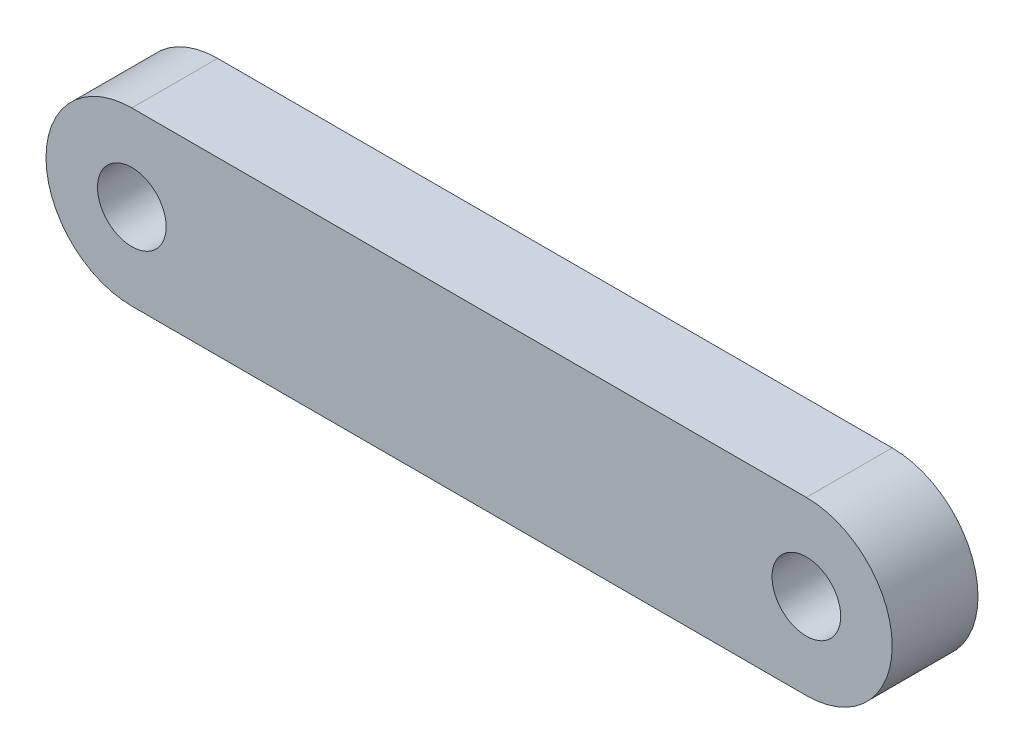
ISO-10303-21;
HEADER;
FILE_DESCRIPTION(('STEP AP214'),'2;1');
FILE_NAME('part.step','',(''),(''),'','','');
FILE_SCHEMA(('AUTOMOTIVE_DESIGN { 1 0 10303 214 1 1 1 1 }'));
ENDSEC;
DATA;
#1=APPLICATION_CONTEXT('core data for automotive mechanical design processes');
#2=APPLICATION_PROTOCOL_DEFINITION('international standard','automotive_design',2000,#1);
#3=PRODUCT_CONTEXT('',#1,'mechanical');
#4=PRODUCT('Part','Part','',(#3));
#5=PRODUCT_RELATED_PRODUCT_CATEGORY('part','',(#4));
#6=PRODUCT_DEFINITION_FORMATION('','',#4);
#7=PRODUCT_DEFINITION_CONTEXT('part definition',#1,'design');
#8=PRODUCT_DEFINITION('design','',#6,#7);
#9=PRODUCT_DEFINITION_SHAPE('','',#8);
#10=(LENGTH_UNIT() NAMED_UNIT(*) SI_UNIT(.MILLI.,.METRE.));
#11=(NAMED_UNIT(*) PLANE_ANGLE_UNIT() SI_UNIT($,.RADIAN.));
#12=(NAMED_UNIT(*) SI_UNIT($,.STERADIAN.) SOLID_ANGLE_UNIT());
#13=UNCERTAINTY_MEASURE_WITH_UNIT(LENGTH_MEASURE(1.E-05),#10,'distance_accuracy_value','');
#14=(GEOMETRIC_REPRESENTATION_CONTEXT(3) GLOBAL_UNCERTAINTY_ASSIGNED_CONTEXT((#13)) GLOBAL_UNIT_ASSIGNED_CONTEXT((#10,
#11,#12)) REPRESENTATION_CONTEXT('',''));
#15=CARTESIAN_POINT('',(0.,0.,0.));
#16=DIRECTION('',(0.,0.,1.));
#17=DIRECTION('',(1.,0.,0.));
#18=AXIS2_PLACEMENT_3D('',#15,#16,#17);
#19=CARTESIAN_POINT('',(-19.65,0.,2.5));
#20=DIRECTION('',(0.,0.,1.));
#21=DIRECTION('',(1.,0.,0.));
#22=AXIS2_PLACEMENT_3D('',#19,#20,#21);
#23=PLANE('',#22);
#24=CARTESIAN_POINT('',(19.65,0.,2.5));
#25=DIRECTION('',(0.,0.,1.));
#26=DIRECTION('',(1.,0.,0.));
#27=AXIS2_PLACEMENT_3D('',#24,#25,#26);
#28=CIRCLE('',#27,2.);
#29=CARTESIAN_POINT('',(21.65,0.,2.5));
#30=VERTEX_POINT('',#29);
#31=EDGE_CURVE('E112',#30,#30,#28,.T.);
#32=ORIENTED_EDGE('',*,*,#31,.F.);
#33=EDGE_LOOP('',(#32));
#34=FACE_BOUND('',#33,.T.);
#35=CARTESIAN_POINT('',(-19.65,0.,2.5));
#36=DIRECTION('',(0.,0.,1.));
#37=DIRECTION('',(1.,0.,0.));
#38=AXIS2_PLACEMENT_3D('',#35,#36,#37);
#39=CIRCLE('',#38,5.);
#40=CARTESIAN_POINT('',(-19.65,5.,2.5));
#41=VERTEX_POINT('',#40);
#42=CARTESIAN_POINT('',(-19.65,-5.,2.5));
#43=VERTEX_POINT('',#42);
#44=EDGE_CURVE('E92',#41,#43,#39,.T.);
#45=ORIENTED_EDGE('',*,*,#44,.T.);
#46=DIRECTION('',(1.,0.,0.));
#47=VECTOR('',#46,1.);
#48=CARTESIAN_POINT('',(-19.65,-5.,2.5));
#49=LINE('',#48,#47);
#50=CARTESIAN_POINT('',(19.65,-4.99999999999999,2.5));
#51=VERTEX_POINT('',#50);
#52=EDGE_CURVE('E87',#43,#51,#49,.T.);
#53=ORIENTED_EDGE('',*,*,#52,.T.);
#54=CARTESIAN_POINT('',(19.65,0.,2.5));
#55=DIRECTION('',(0.,0.,1.));
#56=DIRECTION('',(1.,0.,0.));
#57=AXIS2_PLACEMENT_3D('',#54,#55,#56);
#58=CIRCLE('',#57,5.);
#59=CARTESIAN_POINT('',(19.65,5.00000000000001,2.5));
#60=VERTEX_POINT('',#59);
#61=EDGE_CURVE('E90',#51,#60,#58,.T.);
#62=ORIENTED_EDGE('',*,*,#61,.T.);
#63=DIRECTION('',(-1.,0.,0.));
#64=VECTOR('',#63,1.);
#65=CARTESIAN_POINT('',(-19.65,5.,2.5));
#66=LINE('',#65,#64);
#67=EDGE_CURVE('E57',#60,#41,#66,.T.);
#68=ORIENTED_EDGE('',*,*,#67,.T.);
#69=EDGE_LOOP('',(#45,#53,#62,#68));
#70=FACE_BOUND('',#69,.T.);
#71=CARTESIAN_POINT('',(-19.65,0.,2.5));
#72=DIRECTION('',(0.,0.,1.));
#73=DIRECTION('',(1.,0.,0.));
#74=AXIS2_PLACEMENT_3D('',#71,#72,#73);
#75=CIRCLE('',#74,2.);
#76=CARTESIAN_POINT('',(-17.65,0.,2.5));
#77=VERTEX_POINT('',#76);
#78=EDGE_CURVE('E134',#77,#77,#75,.T.);
#79=ORIENTED_EDGE('',*,*,#78,.F.);
#80=EDGE_LOOP('',(#79));
#81=FACE_BOUND('',#80,.T.);
#82=ADVANCED_FACE('F39',(#34,#70,#81),#23,.T.);
#83=CARTESIAN_POINT('',(-19.65,0.,-2.5));
#84=DIRECTION('',(0.,0.,1.));
#85=DIRECTION('',(1.,0.,0.));
#86=AXIS2_PLACEMENT_3D('',#83,#84,#85);
#87=PLANE('',#86);
#88=CARTESIAN_POINT('',(-19.65,0.,-2.5));
#89=DIRECTION('',(0.,0.,1.));
#90=DIRECTION('',(1.,0.,0.));
#91=AXIS2_PLACEMENT_3D('',#88,#89,#90);
#92=CIRCLE('',#91,5.);
#93=CARTESIAN_POINT('',(-19.65,5.,-2.5));
#94=VERTEX_POINT('',#93);
#95=CARTESIAN_POINT('',(-19.65,-5.,-2.5));
#96=VERTEX_POINT('',#95);
#97=EDGE_CURVE('E108',#94,#96,#92,.T.);
#98=ORIENTED_EDGE('',*,*,#97,.F.);
#99=DIRECTION('',(-1.,0.,0.));
#100=VECTOR('',#99,1.);
#101=CARTESIAN_POINT('',(-19.65,5.,-2.5));
#102=LINE('',#101,#100);
#103=CARTESIAN_POINT('',(19.65,5.00000000000001,-2.5));
#104=VERTEX_POINT('',#103);
#105=EDGE_CURVE('E80',#104,#94,#102,.T.);
#106=ORIENTED_EDGE('',*,*,#105,.F.);
#107=CARTESIAN_POINT('',(19.65,0.,-2.5));
#108=DIRECTION('',(0.,0.,1.));
#109=DIRECTION('',(1.,0.,0.));
#110=AXIS2_PLACEMENT_3D('',#107,#108,#109);
#111=CIRCLE('',#110,5.);
#112=CARTESIAN_POINT('',(19.65,-4.99999999999999,-2.5));
#113=VERTEX_POINT('',#112);
#114=EDGE_CURVE('E74',#113,#104,#111,.T.);
#115=ORIENTED_EDGE('',*,*,#114,.F.);
#116=DIRECTION('',(1.,0.,0.));
#117=VECTOR('',#116,1.);
#118=CARTESIAN_POINT('',(-19.65,-5.,-2.5));
#119=LINE('',#118,#117);
#120=EDGE_CURVE('E97',#96,#113,#119,.T.);
#121=ORIENTED_EDGE('',*,*,#120,.F.);
#122=EDGE_LOOP('',(#98,#106,#115,#121));
#123=FACE_BOUND('',#122,.T.);
#124=CARTESIAN_POINT('',(19.65,0.,-2.5));
#125=DIRECTION('',(0.,0.,1.));
#126=DIRECTION('',(1.,0.,0.));
#127=AXIS2_PLACEMENT_3D('',#124,#125,#126);
#128=CIRCLE('',#127,2.);
#129=CARTESIAN_POINT('',(21.65,0.,-2.5));
#130=VERTEX_POINT('',#129);
#131=EDGE_CURVE('E130',#130,#130,#128,.T.);
#132=ORIENTED_EDGE('',*,*,#131,.T.);
#133=EDGE_LOOP('',(#132));
#134=FACE_BOUND('',#133,.T.);
#135=CARTESIAN_POINT('',(-19.65,0.,-2.5));
#136=DIRECTION('',(0.,0.,1.));
#137=DIRECTION('',(1.,0.,0.));
#138=AXIS2_PLACEMENT_3D('',#135,#136,#137);
#139=CIRCLE('',#138,2.);
#140=CARTESIAN_POINT('',(-17.65,0.,-2.5));
#141=VERTEX_POINT('',#140);
#142=EDGE_CURVE('E138',#141,#141,#139,.T.);
#143=ORIENTED_EDGE('',*,*,#142,.T.);
#144=EDGE_LOOP('',(#143));
#145=FACE_BOUND('',#144,.T.);
#146=ADVANCED_FACE('F125',(#123,#134,#145),#87,.F.);
#147=CARTESIAN_POINT('',(-19.65,0.,2.5));
#148=DIRECTION('',(0.,0.,-1.));
#149=DIRECTION('',(-1.,0.,0.));
#150=AXIS2_PLACEMENT_3D('',#147,#148,#149);
#151=CYLINDRICAL_SURFACE('',#150,5.);
#152=ORIENTED_EDGE('',*,*,#97,.T.);
#153=DIRECTION('',(0.,0.,-1.));
#154=VECTOR('',#153,1.);
#155=CARTESIAN_POINT('',(-19.65,-5.,2.5));
#156=LINE('',#155,#154);
#157=EDGE_CURVE('E11',#43,#96,#156,.T.);
#158=ORIENTED_EDGE('',*,*,#157,.F.);
#159=ORIENTED_EDGE('',*,*,#44,.F.);
#160=DIRECTION('',(0.,0.,-1.));
#161=VECTOR('',#160,1.);
#162=CARTESIAN_POINT('',(-19.65,5.,2.5));
#163=LINE('',#162,#161);
#164=EDGE_CURVE('E104',#41,#94,#163,.T.);
#165=ORIENTED_EDGE('',*,*,#164,.T.);
#166=EDGE_LOOP('',(#152,#158,#159,#165));
#167=FACE_BOUND('',#166,.T.);
#168=ADVANCED_FACE('F41',(#167),#151,.T.);
#169=CARTESIAN_POINT('',(-19.65,-5.,2.5));
#170=DIRECTION('',(0.,1.,0.));
#171=DIRECTION('',(-1.,0.,0.));
#172=AXIS2_PLACEMENT_3D('',#169,#170,#171);
#173=PLANE('',#172);
#174=ORIENTED_EDGE('',*,*,#120,.T.);
#175=DIRECTION('',(0.,0.,-1.));
#176=VECTOR('',#175,1.);
#177=CARTESIAN_POINT('',(19.65,-4.99999999999999,2.5));
#178=LINE('',#177,#176);
#179=EDGE_CURVE('E49',#51,#113,#178,.T.);
#180=ORIENTED_EDGE('',*,*,#179,.F.);
#181=ORIENTED_EDGE('',*,*,#52,.F.);
#182=ORIENTED_EDGE('',*,*,#157,.T.);
#183=EDGE_LOOP('',(#174,#180,#181,#182));
#184=FACE_BOUND('',#183,.T.);
#185=ADVANCED_FACE('F96',(#184),#173,.F.);
#186=CARTESIAN_POINT('',(19.65,0.,2.5));
#187=DIRECTION('',(0.,0.,-1.));
#188=DIRECTION('',(-1.,0.,0.));
#189=AXIS2_PLACEMENT_3D('',#186,#187,#188);
#190=CYLINDRICAL_SURFACE('',#189,5.);
#191=ORIENTED_EDGE('',*,*,#114,.T.);
#192=DIRECTION('',(0.,0.,-1.));
#193=VECTOR('',#192,1.);
#194=CARTESIAN_POINT('',(19.65,5.00000000000001,2.5));
#195=LINE('',#194,#193);
#196=EDGE_CURVE('E99',#60,#104,#195,.T.);
#197=ORIENTED_EDGE('',*,*,#196,.F.);
#198=ORIENTED_EDGE('',*,*,#61,.F.);
#199=ORIENTED_EDGE('',*,*,#179,.T.);
#200=EDGE_LOOP('',(#191,#197,#198,#199));
#201=FACE_BOUND('',#200,.T.);
#202=ADVANCED_FACE('F100',(#201),#190,.T.);
#203=CARTESIAN_POINT('',(-19.65,5.,2.5));
#204=DIRECTION('',(0.,-1.,0.));
#205=DIRECTION('',(1.,0.,0.));
#206=AXIS2_PLACEMENT_3D('',#203,#204,#205);
#207=PLANE('',#206);
#208=ORIENTED_EDGE('',*,*,#105,.T.);
#209=ORIENTED_EDGE('',*,*,#164,.F.);
#210=ORIENTED_EDGE('',*,*,#67,.F.);
#211=ORIENTED_EDGE('',*,*,#196,.T.);
#212=EDGE_LOOP('',(#208,#209,#210,#211));
#213=FACE_BOUND('',#212,.T.);
#214=ADVANCED_FACE('F122',(#213),#207,.F.);
#215=CARTESIAN_POINT('',(19.65,0.,2.5));
#216=DIRECTION('',(0.,0.,-1.));
#217=DIRECTION('',(-1.,0.,0.));
#218=AXIS2_PLACEMENT_3D('',#215,#216,#217);
#219=CYLINDRICAL_SURFACE('',#218,2.);
#220=ORIENTED_EDGE('',*,*,#31,.T.);
#221=EDGE_LOOP('',(#220));
#222=FACE_BOUND('',#221,.T.);
#223=ORIENTED_EDGE('',*,*,#131,.F.);
#224=EDGE_LOOP('',(#223));
#225=FACE_BOUND('',#224,.T.);
#226=ADVANCED_FACE('F157',(#222,#225),#219,.F.);
#227=CARTESIAN_POINT('',(-19.65,0.,2.5));
#228=DIRECTION('',(0.,0.,-1.));
#229=DIRECTION('',(-1.,0.,0.));
#230=AXIS2_PLACEMENT_3D('',#227,#228,#229);
#231=CYLINDRICAL_SURFACE('',#230,2.);
#232=ORIENTED_EDGE('',*,*,#78,.T.);
#233=EDGE_LOOP('',(#232));
#234=FACE_BOUND('',#233,.T.);
#235=ORIENTED_EDGE('',*,*,#142,.F.);
#236=EDGE_LOOP('',(#235));
#237=FACE_BOUND('',#236,.T.);
#238=ADVANCED_FACE('F146',(#234,#237),#231,.F.);
#239=CLOSED_SHELL('',(#82,#146,#168,#185,#202,#214,#226,#238));
#240=MANIFOLD_SOLID_BREP('B2',#239);
#241=ADVANCED_BREP_SHAPE_REPRESENTATION('',(#18,#240),#14);
#242=SHAPE_DEFINITION_REPRESENTATION(#9,#241);
ENDSEC;
END-ISO-10303-21;
